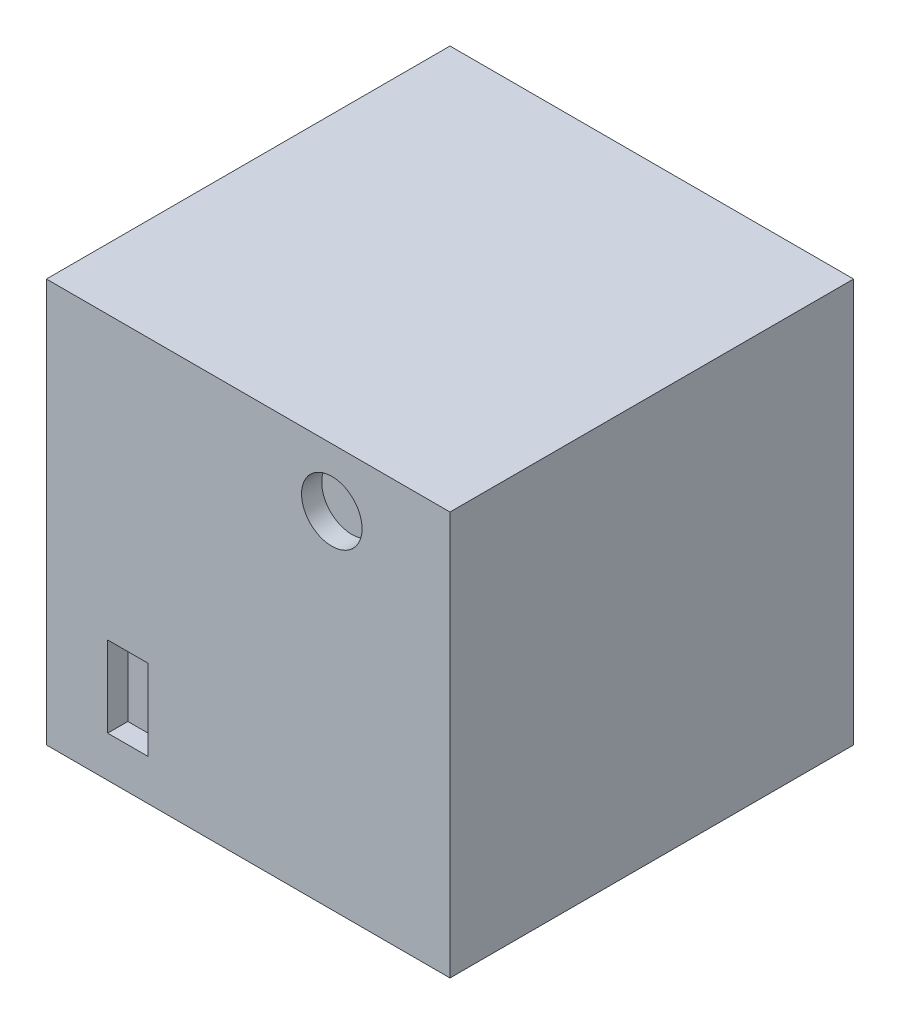
ISO-10303-21;
HEADER;
FILE_DESCRIPTION(('STEP AP214'),'2;1');
FILE_NAME('part.step','',(''),(''),'','','');
FILE_SCHEMA(('AUTOMOTIVE_DESIGN { 1 0 10303 214 1 1 1 1 }'));
ENDSEC;
DATA;
#1=APPLICATION_CONTEXT('core data for automotive mechanical design processes');
#2=APPLICATION_PROTOCOL_DEFINITION('international standard','automotive_design',2000,#1);
#3=PRODUCT_CONTEXT('',#1,'mechanical');
#4=PRODUCT('Part','Part','',(#3));
#5=PRODUCT_RELATED_PRODUCT_CATEGORY('part','',(#4));
#6=PRODUCT_DEFINITION_FORMATION('','',#4);
#7=PRODUCT_DEFINITION_CONTEXT('part definition',#1,'design');
#8=PRODUCT_DEFINITION('design','',#6,#7);
#9=PRODUCT_DEFINITION_SHAPE('','',#8);
#10=(LENGTH_UNIT() NAMED_UNIT(*) SI_UNIT(.MILLI.,.METRE.));
#11=(NAMED_UNIT(*) PLANE_ANGLE_UNIT() SI_UNIT($,.RADIAN.));
#12=(NAMED_UNIT(*) SI_UNIT($,.STERADIAN.) SOLID_ANGLE_UNIT());
#13=UNCERTAINTY_MEASURE_WITH_UNIT(LENGTH_MEASURE(1.E-05),#10,'distance_accuracy_value','');
#14=(GEOMETRIC_REPRESENTATION_CONTEXT(3) GLOBAL_UNCERTAINTY_ASSIGNED_CONTEXT((#13)) GLOBAL_UNIT_ASSIGNED_CONTEXT((#10,
#11,#12)) REPRESENTATION_CONTEXT('',''));
#15=CARTESIAN_POINT('',(0.,0.,0.));
#16=DIRECTION('',(0.,0.,1.));
#17=DIRECTION('',(1.,0.,0.));
#18=AXIS2_PLACEMENT_3D('',#15,#16,#17);
#19=CARTESIAN_POINT('',(0.,0.,-10.));
#20=DIRECTION('',(-1.,0.,0.));
#21=DIRECTION('',(0.,0.,1.));
#22=AXIS2_PLACEMENT_3D('',#19,#20,#21);
#23=PLANE('',#22);
#24=DIRECTION('',(0.,-1.,0.));
#25=VECTOR('',#24,1.);
#26=CARTESIAN_POINT('',(0.,0.,0.));
#27=LINE('',#26,#25);
#28=CARTESIAN_POINT('',(0.,9.99999999999999,0.));
#29=VERTEX_POINT('',#28);
#30=CARTESIAN_POINT('',(0.,0.,0.));
#31=VERTEX_POINT('',#30);
#32=EDGE_CURVE('E152',#29,#31,#27,.T.);
#33=ORIENTED_EDGE('',*,*,#32,.F.);
#34=DIRECTION('',(0.,0.,1.));
#35=VECTOR('',#34,1.);
#36=CARTESIAN_POINT('',(0.,9.99999999999999,-10.));
#37=LINE('',#36,#35);
#38=CARTESIAN_POINT('',(0.,9.99999999999999,-10.));
#39=VERTEX_POINT('',#38);
#40=EDGE_CURVE('E11',#39,#29,#37,.T.);
#41=ORIENTED_EDGE('',*,*,#40,.F.);
#42=DIRECTION('',(0.,-1.,0.));
#43=VECTOR('',#42,1.);
#44=CARTESIAN_POINT('',(0.,0.,-10.));
#45=LINE('',#44,#43);
#46=CARTESIAN_POINT('',(0.,0.,-10.));
#47=VERTEX_POINT('',#46);
#48=EDGE_CURVE('E155',#39,#47,#45,.T.);
#49=ORIENTED_EDGE('',*,*,#48,.T.);
#50=DIRECTION('',(0.,0.,1.));
#51=VECTOR('',#50,1.);
#52=CARTESIAN_POINT('',(0.,0.,-10.));
#53=LINE('',#52,#51);
#54=EDGE_CURVE('E37',#47,#31,#53,.T.);
#55=ORIENTED_EDGE('',*,*,#54,.T.);
#56=EDGE_LOOP('',(#33,#41,#49,#55));
#57=FACE_BOUND('',#56,.T.);
#58=ADVANCED_FACE('F34',(#57),#23,.T.);
#59=CARTESIAN_POINT('',(0.,9.99999999999999,-10.));
#60=DIRECTION('',(0.,1.,0.));
#61=DIRECTION('',(0.,0.,1.));
#62=AXIS2_PLACEMENT_3D('',#59,#60,#61);
#63=PLANE('',#62);
#64=DIRECTION('',(-1.,0.,0.));
#65=VECTOR('',#64,1.);
#66=CARTESIAN_POINT('',(0.,9.99999999999999,0.));
#67=LINE('',#66,#65);
#68=CARTESIAN_POINT('',(9.99999999999999,9.99999999999999,0.));
#69=VERTEX_POINT('',#68);
#70=EDGE_CURVE('E158',#69,#29,#67,.T.);
#71=ORIENTED_EDGE('',*,*,#70,.F.);
#72=DIRECTION('',(0.,0.,1.));
#73=VECTOR('',#72,1.);
#74=CARTESIAN_POINT('',(9.99999999999999,9.99999999999999,-10.));
#75=LINE('',#74,#73);
#76=CARTESIAN_POINT('',(9.99999999999999,9.99999999999999,-10.));
#77=VERTEX_POINT('',#76);
#78=EDGE_CURVE('E42',#77,#69,#75,.T.);
#79=ORIENTED_EDGE('',*,*,#78,.F.);
#80=DIRECTION('',(-1.,0.,0.));
#81=VECTOR('',#80,1.);
#82=CARTESIAN_POINT('',(0.,9.99999999999999,-10.));
#83=LINE('',#82,#81);
#84=EDGE_CURVE('E163',#77,#39,#83,.T.);
#85=ORIENTED_EDGE('',*,*,#84,.T.);
#86=ORIENTED_EDGE('',*,*,#40,.T.);
#87=EDGE_LOOP('',(#71,#79,#85,#86));
#88=FACE_BOUND('',#87,.T.);
#89=ADVANCED_FACE('F180',(#88),#63,.T.);
#90=CARTESIAN_POINT('',(9.99999999999999,0.,-10.));
#91=DIRECTION('',(1.,0.,0.));
#92=DIRECTION('',(0.,0.,-1.));
#93=AXIS2_PLACEMENT_3D('',#90,#91,#92);
#94=PLANE('',#93);
#95=DIRECTION('',(0.,1.,0.));
#96=VECTOR('',#95,1.);
#97=CARTESIAN_POINT('',(9.99999999999999,0.,0.));
#98=LINE('',#97,#96);
#99=CARTESIAN_POINT('',(9.99999999999999,0.,0.));
#100=VERTEX_POINT('',#99);
#101=EDGE_CURVE('E170',#100,#69,#98,.T.);
#102=ORIENTED_EDGE('',*,*,#101,.F.);
#103=DIRECTION('',(0.,0.,1.));
#104=VECTOR('',#103,1.);
#105=CARTESIAN_POINT('',(9.99999999999999,0.,-10.));
#106=LINE('',#105,#104);
#107=CARTESIAN_POINT('',(9.99999999999999,0.,-10.));
#108=VERTEX_POINT('',#107);
#109=EDGE_CURVE('E175',#108,#100,#106,.T.);
#110=ORIENTED_EDGE('',*,*,#109,.F.);
#111=DIRECTION('',(0.,1.,0.));
#112=VECTOR('',#111,1.);
#113=CARTESIAN_POINT('',(9.99999999999999,0.,-10.));
#114=LINE('',#113,#112);
#115=EDGE_CURVE('E160',#108,#77,#114,.T.);
#116=ORIENTED_EDGE('',*,*,#115,.T.);
#117=ORIENTED_EDGE('',*,*,#78,.T.);
#118=EDGE_LOOP('',(#102,#110,#116,#117));
#119=FACE_BOUND('',#118,.T.);
#120=ADVANCED_FACE('F184',(#119),#94,.T.);
#121=CARTESIAN_POINT('',(0.,0.,-10.));
#122=DIRECTION('',(0.,-1.,0.));
#123=DIRECTION('',(0.,0.,-1.));
#124=AXIS2_PLACEMENT_3D('',#121,#122,#123);
#125=PLANE('',#124);
#126=DIRECTION('',(1.,0.,0.));
#127=VECTOR('',#126,1.);
#128=CARTESIAN_POINT('',(0.,0.,0.));
#129=LINE('',#128,#127);
#130=EDGE_CURVE('E167',#31,#100,#129,.T.);
#131=ORIENTED_EDGE('',*,*,#130,.F.);
#132=ORIENTED_EDGE('',*,*,#54,.F.);
#133=DIRECTION('',(1.,0.,0.));
#134=VECTOR('',#133,1.);
#135=CARTESIAN_POINT('',(0.,0.,-10.));
#136=LINE('',#135,#134);
#137=EDGE_CURVE('E157',#47,#108,#136,.T.);
#138=ORIENTED_EDGE('',*,*,#137,.T.);
#139=ORIENTED_EDGE('',*,*,#109,.T.);
#140=EDGE_LOOP('',(#131,#132,#138,#139));
#141=FACE_BOUND('',#140,.T.);
#142=ADVANCED_FACE('F177',(#141),#125,.T.);
#143=CARTESIAN_POINT('',(0.,0.,-10.));
#144=DIRECTION('',(0.,0.,-1.));
#145=DIRECTION('',(-1.,0.,0.));
#146=AXIS2_PLACEMENT_3D('',#143,#144,#145);
#147=PLANE('',#146);
#148=ORIENTED_EDGE('',*,*,#48,.F.);
#149=ORIENTED_EDGE('',*,*,#84,.F.);
#150=ORIENTED_EDGE('',*,*,#115,.F.);
#151=ORIENTED_EDGE('',*,*,#137,.F.);
#152=EDGE_LOOP('',(#148,#149,#150,#151));
#153=FACE_BOUND('',#152,.T.);
#154=ADVANCED_FACE('F186',(#153),#147,.T.);
#155=CARTESIAN_POINT('',(0.,0.,0.));
#156=DIRECTION('',(0.,0.,-1.));
#157=DIRECTION('',(-1.,0.,0.));
#158=AXIS2_PLACEMENT_3D('',#155,#156,#157);
#159=PLANE('',#158);
#160=CARTESIAN_POINT('',(7.07093339085926,8.55126725914017,0.));
#161=DIRECTION('',(0.,0.,1.));
#162=DIRECTION('',(1.,0.,0.));
#163=AXIS2_PLACEMENT_3D('',#160,#161,#162);
#164=CIRCLE('',#163,0.75);
#165=CARTESIAN_POINT('',(7.82093339085926,8.55126725914017,0.));
#166=VERTEX_POINT('',#165);
#167=EDGE_CURVE('E132',#166,#166,#164,.T.);
#168=ORIENTED_EDGE('',*,*,#167,.F.);
#169=EDGE_LOOP('',(#168));
#170=FACE_BOUND('',#169,.T.);
#171=DIRECTION('',(1.,0.,0.));
#172=VECTOR('',#171,1.);
#173=CARTESIAN_POINT('',(1.5177638538885,1.01343796950911,0.));
#174=LINE('',#173,#172);
#175=CARTESIAN_POINT('',(1.5177638538885,1.01343796950911,0.));
#176=VERTEX_POINT('',#175);
#177=CARTESIAN_POINT('',(2.5177638538885,1.01343796950911,0.));
#178=VERTEX_POINT('',#177);
#179=EDGE_CURVE('E138',#176,#178,#174,.T.);
#180=ORIENTED_EDGE('',*,*,#179,.F.);
#181=DIRECTION('',(0.,-1.,0.));
#182=VECTOR('',#181,1.);
#183=CARTESIAN_POINT('',(1.5177638538885,3.01343796950911,0.));
#184=LINE('',#183,#182);
#185=CARTESIAN_POINT('',(1.5177638538885,3.01343796950911,0.));
#186=VERTEX_POINT('',#185);
#187=EDGE_CURVE('E50',#186,#176,#184,.T.);
#188=ORIENTED_EDGE('',*,*,#187,.F.);
#189=DIRECTION('',(-1.,0.,0.));
#190=VECTOR('',#189,1.);
#191=CARTESIAN_POINT('',(1.5177638538885,3.01343796950911,0.));
#192=LINE('',#191,#190);
#193=CARTESIAN_POINT('',(2.5177638538885,3.01343796950911,0.));
#194=VERTEX_POINT('',#193);
#195=EDGE_CURVE('E126',#194,#186,#192,.T.);
#196=ORIENTED_EDGE('',*,*,#195,.F.);
#197=DIRECTION('',(0.,1.,0.));
#198=VECTOR('',#197,1.);
#199=CARTESIAN_POINT('',(2.5177638538885,3.01343796950911,0.));
#200=LINE('',#199,#198);
#201=EDGE_CURVE('E129',#178,#194,#200,.T.);
#202=ORIENTED_EDGE('',*,*,#201,.F.);
#203=EDGE_LOOP('',(#180,#188,#196,#202));
#204=FACE_BOUND('',#203,.T.);
#205=ORIENTED_EDGE('',*,*,#32,.T.);
#206=ORIENTED_EDGE('',*,*,#130,.T.);
#207=ORIENTED_EDGE('',*,*,#101,.T.);
#208=ORIENTED_EDGE('',*,*,#70,.T.);
#209=EDGE_LOOP('',(#205,#206,#207,#208));
#210=FACE_BOUND('',#209,.T.);
#211=ADVANCED_FACE('F179',(#170,#204,#210),#159,.F.);
#212=CARTESIAN_POINT('',(1.5177638538885,3.01343796950911,-0.5));
#213=DIRECTION('',(-1.,0.,0.));
#214=DIRECTION('',(0.,-1.,0.));
#215=AXIS2_PLACEMENT_3D('',#212,#213,#214);
#216=PLANE('',#215);
#217=ORIENTED_EDGE('',*,*,#187,.T.);
#218=DIRECTION('',(0.,0.,1.));
#219=VECTOR('',#218,1.);
#220=CARTESIAN_POINT('',(1.5177638538885,1.01343796950911,-0.5));
#221=LINE('',#220,#219);
#222=CARTESIAN_POINT('',(1.5177638538885,1.01343796950911,-0.5));
#223=VERTEX_POINT('',#222);
#224=EDGE_CURVE('E104',#223,#176,#221,.T.);
#225=ORIENTED_EDGE('',*,*,#224,.F.);
#226=DIRECTION('',(0.,-1.,0.));
#227=VECTOR('',#226,1.);
#228=CARTESIAN_POINT('',(1.5177638538885,3.01343796950911,-0.5));
#229=LINE('',#228,#227);
#230=CARTESIAN_POINT('',(1.5177638538885,3.01343796950911,-0.5));
#231=VERTEX_POINT('',#230);
#232=EDGE_CURVE('E108',#231,#223,#229,.T.);
#233=ORIENTED_EDGE('',*,*,#232,.F.);
#234=DIRECTION('',(0.,0.,1.));
#235=VECTOR('',#234,1.);
#236=CARTESIAN_POINT('',(1.5177638538885,3.01343796950911,-0.5));
#237=LINE('',#236,#235);
#238=EDGE_CURVE('E143',#231,#186,#237,.T.);
#239=ORIENTED_EDGE('',*,*,#238,.T.);
#240=EDGE_LOOP('',(#217,#225,#233,#239));
#241=FACE_BOUND('',#240,.T.);
#242=ADVANCED_FACE('F106',(#241),#216,.F.);
#243=CARTESIAN_POINT('',(1.5177638538885,3.01343796950911,-0.5));
#244=DIRECTION('',(0.,1.,0.));
#245=DIRECTION('',(0.,0.,1.));
#246=AXIS2_PLACEMENT_3D('',#243,#244,#245);
#247=PLANE('',#246);
#248=ORIENTED_EDGE('',*,*,#195,.T.);
#249=ORIENTED_EDGE('',*,*,#238,.F.);
#250=DIRECTION('',(-1.,0.,0.));
#251=VECTOR('',#250,1.);
#252=CARTESIAN_POINT('',(1.5177638538885,3.01343796950911,-0.5));
#253=LINE('',#252,#251);
#254=CARTESIAN_POINT('',(2.5177638538885,3.01343796950911,-0.5));
#255=VERTEX_POINT('',#254);
#256=EDGE_CURVE('E114',#255,#231,#253,.T.);
#257=ORIENTED_EDGE('',*,*,#256,.F.);
#258=DIRECTION('',(0.,0.,1.));
#259=VECTOR('',#258,1.);
#260=CARTESIAN_POINT('',(2.5177638538885,3.01343796950911,-0.5));
#261=LINE('',#260,#259);
#262=EDGE_CURVE('E146',#255,#194,#261,.T.);
#263=ORIENTED_EDGE('',*,*,#262,.T.);
#264=EDGE_LOOP('',(#248,#249,#257,#263));
#265=FACE_BOUND('',#264,.T.);
#266=ADVANCED_FACE('F257',(#265),#247,.F.);
#267=CARTESIAN_POINT('',(2.5177638538885,3.01343796950911,-0.5));
#268=DIRECTION('',(1.,0.,0.));
#269=DIRECTION('',(0.,0.,-1.));
#270=AXIS2_PLACEMENT_3D('',#267,#268,#269);
#271=PLANE('',#270);
#272=ORIENTED_EDGE('',*,*,#201,.T.);
#273=ORIENTED_EDGE('',*,*,#262,.F.);
#274=DIRECTION('',(0.,1.,0.));
#275=VECTOR('',#274,1.);
#276=CARTESIAN_POINT('',(2.5177638538885,3.01343796950911,-0.5));
#277=LINE('',#276,#275);
#278=CARTESIAN_POINT('',(2.5177638538885,1.01343796950911,-0.5));
#279=VERTEX_POINT('',#278);
#280=EDGE_CURVE('E122',#279,#255,#277,.T.);
#281=ORIENTED_EDGE('',*,*,#280,.F.);
#282=DIRECTION('',(0.,0.,1.));
#283=VECTOR('',#282,1.);
#284=CARTESIAN_POINT('',(2.5177638538885,1.01343796950911,-0.5));
#285=LINE('',#284,#283);
#286=EDGE_CURVE('E113',#279,#178,#285,.T.);
#287=ORIENTED_EDGE('',*,*,#286,.T.);
#288=EDGE_LOOP('',(#272,#273,#281,#287));
#289=FACE_BOUND('',#288,.T.);
#290=ADVANCED_FACE('F266',(#289),#271,.F.);
#291=CARTESIAN_POINT('',(1.5177638538885,1.01343796950911,-0.5));
#292=DIRECTION('',(0.,-1.,0.));
#293=DIRECTION('',(0.,0.,-1.));
#294=AXIS2_PLACEMENT_3D('',#291,#292,#293);
#295=PLANE('',#294);
#296=ORIENTED_EDGE('',*,*,#179,.T.);
#297=ORIENTED_EDGE('',*,*,#286,.F.);
#298=DIRECTION('',(1.,0.,0.));
#299=VECTOR('',#298,1.);
#300=CARTESIAN_POINT('',(1.5177638538885,1.01343796950911,-0.5));
#301=LINE('',#300,#299);
#302=EDGE_CURVE('E117',#223,#279,#301,.T.);
#303=ORIENTED_EDGE('',*,*,#302,.F.);
#304=ORIENTED_EDGE('',*,*,#224,.T.);
#305=EDGE_LOOP('',(#296,#297,#303,#304));
#306=FACE_BOUND('',#305,.T.);
#307=ADVANCED_FACE('F118',(#306),#295,.F.);
#308=CARTESIAN_POINT('',(0.,0.,-0.5));
#309=DIRECTION('',(0.,0.,1.));
#310=DIRECTION('',(1.,0.,0.));
#311=AXIS2_PLACEMENT_3D('',#308,#309,#310);
#312=PLANE('',#311);
#313=ORIENTED_EDGE('',*,*,#232,.T.);
#314=ORIENTED_EDGE('',*,*,#302,.T.);
#315=ORIENTED_EDGE('',*,*,#280,.T.);
#316=ORIENTED_EDGE('',*,*,#256,.T.);
#317=EDGE_LOOP('',(#313,#314,#315,#316));
#318=FACE_BOUND('',#317,.T.);
#319=ADVANCED_FACE('F124',(#318),#312,.T.);
#320=CARTESIAN_POINT('',(7.07093339085926,8.55126725914017,-0.5));
#321=DIRECTION('',(0.,0.,1.));
#322=DIRECTION('',(1.,0.,0.));
#323=AXIS2_PLACEMENT_3D('',#320,#321,#322);
#324=CYLINDRICAL_SURFACE('',#323,0.75);
#325=CARTESIAN_POINT('',(7.07093339085926,8.55126725914017,-0.5));
#326=DIRECTION('',(0.,0.,1.));
#327=DIRECTION('',(1.,0.,0.));
#328=AXIS2_PLACEMENT_3D('',#325,#326,#327);
#329=CIRCLE('',#328,0.75);
#330=CARTESIAN_POINT('',(7.82093339085926,8.55126725914017,-0.5));
#331=VERTEX_POINT('',#330);
#332=EDGE_CURVE('E139',#331,#331,#329,.T.);
#333=ORIENTED_EDGE('',*,*,#332,.F.);
#334=EDGE_LOOP('',(#333));
#335=FACE_BOUND('',#334,.T.);
#336=ORIENTED_EDGE('',*,*,#167,.T.);
#337=EDGE_LOOP('',(#336));
#338=FACE_BOUND('',#337,.T.);
#339=ADVANCED_FACE('F292',(#335,#338),#324,.F.);
#340=CARTESIAN_POINT('',(7.07093339085926,8.55126725914017,-0.5));
#341=DIRECTION('',(0.,0.,1.));
#342=DIRECTION('',(1.,0.,0.));
#343=AXIS2_PLACEMENT_3D('',#340,#341,#342);
#344=PLANE('',#343);
#345=ORIENTED_EDGE('',*,*,#332,.T.);
#346=EDGE_LOOP('',(#345));
#347=FACE_BOUND('',#346,.T.);
#348=ADVANCED_FACE('F304',(#347),#344,.T.);
#349=CLOSED_SHELL('',(#58,#89,#120,#142,#154,#211,#242,#266,#290,#307,#319,#339,#348));
#350=CARTESIAN_POINT('',(8.02202872592055,7.60017192407885,-2.));
#351=DIRECTION('',(0.,0.,-1.));
#352=DIRECTION('',(-1.,0.,0.));
#353=AXIS2_PLACEMENT_3D('',#350,#351,#352);
#354=CYLINDRICAL_SURFACE('',#353,1.);
#355=CARTESIAN_POINT('',(8.02202872592055,7.60017192407885,-2.));
#356=DIRECTION('',(0.,0.,-1.));
#357=DIRECTION('',(-1.,0.,0.));
#358=AXIS2_PLACEMENT_3D('',#355,#356,#357);
#359=CIRCLE('',#358,1.);
#360=CARTESIAN_POINT('',(7.02202872592055,7.60017192407885,-2.));
#361=VERTEX_POINT('',#360);
#362=EDGE_CURVE('E149',#361,#361,#359,.T.);
#363=ORIENTED_EDGE('',*,*,#362,.F.);
#364=EDGE_LOOP('',(#363));
#365=FACE_BOUND('',#364,.T.);
#366=CARTESIAN_POINT('',(8.02202872592055,7.60017192407885,-3.));
#367=DIRECTION('',(0.,0.,-1.));
#368=DIRECTION('',(-1.,0.,0.));
#369=AXIS2_PLACEMENT_3D('',#366,#367,#368);
#370=CIRCLE('',#369,1.);
#371=CARTESIAN_POINT('',(7.02202872592055,7.60017192407885,-3.));
#372=VERTEX_POINT('',#371);
#373=EDGE_CURVE('E145',#372,#372,#370,.T.);
#374=ORIENTED_EDGE('',*,*,#373,.T.);
#375=EDGE_LOOP('',(#374));
#376=FACE_BOUND('',#375,.T.);
#377=ADVANCED_FACE('F222',(#365,#376),#354,.F.);
#378=CARTESIAN_POINT('',(8.02202872592055,7.60017192407885,-2.));
#379=DIRECTION('',(0.,0.,-1.));
#380=DIRECTION('',(-1.,0.,0.));
#381=AXIS2_PLACEMENT_3D('',#378,#379,#380);
#382=PLANE('',#381);
#383=ORIENTED_EDGE('',*,*,#362,.T.);
#384=EDGE_LOOP('',(#383));
#385=FACE_BOUND('',#384,.T.);
#386=ADVANCED_FACE('F227',(#385),#382,.T.);
#387=CARTESIAN_POINT('',(8.02202872592055,7.60017192407885,-3.));
#388=DIRECTION('',(0.,0.,-1.));
#389=DIRECTION('',(-1.,0.,0.));
#390=AXIS2_PLACEMENT_3D('',#387,#388,#389);
#391=PLANE('',#390);
#392=ORIENTED_EDGE('',*,*,#373,.F.);
#393=EDGE_LOOP('',(#392));
#394=FACE_BOUND('',#393,.T.);
#395=ADVANCED_FACE('F238',(#394),#391,.F.);
#396=CLOSED_SHELL('',(#377,#386,#395));
#397=ORIENTED_CLOSED_SHELL('',*,#396,.T.);
#398=BREP_WITH_VOIDS('B2',#349,(#397));
#399=ADVANCED_BREP_SHAPE_REPRESENTATION('',(#18,#398),#14);
#400=SHAPE_DEFINITION_REPRESENTATION(#9,#399);
ENDSEC;
END-ISO-10303-21;
